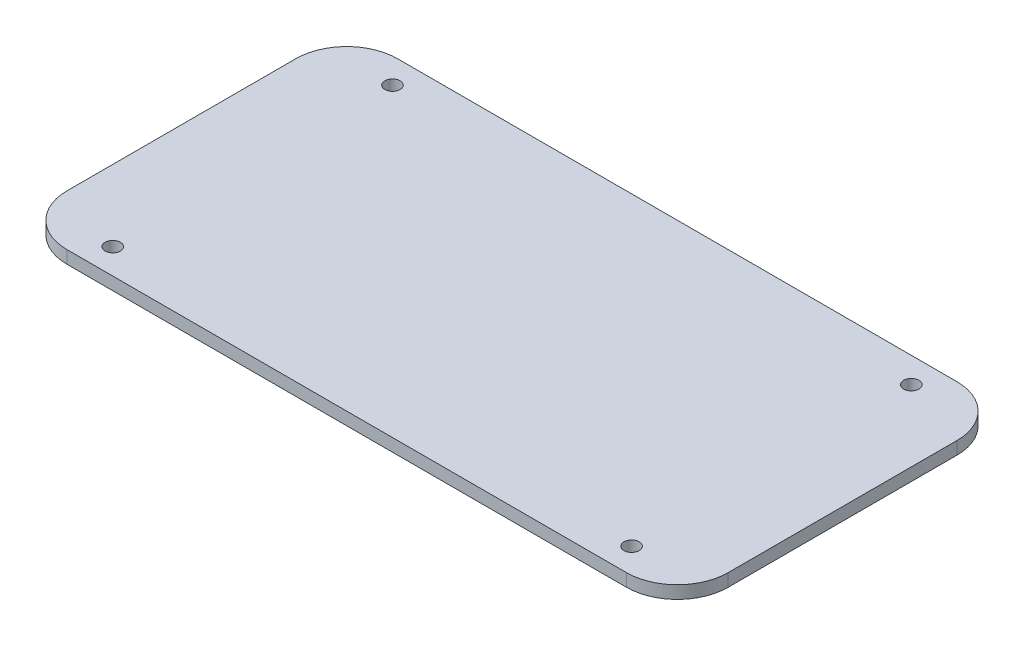
ISO-10303-21;
HEADER;
FILE_DESCRIPTION(('STEP AP214'),'2;1');
FILE_NAME('part.step','',(''),(''),'','','');
FILE_SCHEMA(('AUTOMOTIVE_DESIGN { 1 0 10303 214 1 1 1 1 }'));
ENDSEC;
DATA;
#1=APPLICATION_CONTEXT('core data for automotive mechanical design processes');
#2=APPLICATION_PROTOCOL_DEFINITION('international standard','automotive_design',2000,#1);
#3=PRODUCT_CONTEXT('',#1,'mechanical');
#4=PRODUCT('Part','Part','',(#3));
#5=PRODUCT_RELATED_PRODUCT_CATEGORY('part','',(#4));
#6=PRODUCT_DEFINITION_FORMATION('','',#4);
#7=PRODUCT_DEFINITION_CONTEXT('part definition',#1,'design');
#8=PRODUCT_DEFINITION('design','',#6,#7);
#9=PRODUCT_DEFINITION_SHAPE('','',#8);
#10=(LENGTH_UNIT() NAMED_UNIT(*) SI_UNIT(.MILLI.,.METRE.));
#11=(NAMED_UNIT(*) PLANE_ANGLE_UNIT() SI_UNIT($,.RADIAN.));
#12=(NAMED_UNIT(*) SI_UNIT($,.STERADIAN.) SOLID_ANGLE_UNIT());
#13=UNCERTAINTY_MEASURE_WITH_UNIT(LENGTH_MEASURE(1.E-05),#10,'distance_accuracy_value','');
#14=(GEOMETRIC_REPRESENTATION_CONTEXT(3) GLOBAL_UNCERTAINTY_ASSIGNED_CONTEXT((#13)) GLOBAL_UNIT_ASSIGNED_CONTEXT((#10,
#11,#12)) REPRESENTATION_CONTEXT('',''));
#15=CARTESIAN_POINT('',(0.,0.,0.));
#16=DIRECTION('',(0.,0.,1.));
#17=DIRECTION('',(1.,0.,0.));
#18=AXIS2_PLACEMENT_3D('',#15,#16,#17);
#19=CARTESIAN_POINT('',(10.,2.5,-55.));
#20=DIRECTION('',(0.,-1.,0.));
#21=DIRECTION('',(0.,0.,-1.));
#22=AXIS2_PLACEMENT_3D('',#19,#20,#21);
#23=CYLINDRICAL_SURFACE('',#22,10.);
#24=CARTESIAN_POINT('',(10.,0.,-55.));
#25=DIRECTION('',(0.,1.,0.));
#26=DIRECTION('',(0.,0.,1.));
#27=AXIS2_PLACEMENT_3D('',#24,#25,#26);
#28=CIRCLE('',#27,10.);
#29=CARTESIAN_POINT('',(10.,0.,-65.));
#30=VERTEX_POINT('',#29);
#31=CARTESIAN_POINT('',(0.,0.,-55.));
#32=VERTEX_POINT('',#31);
#33=EDGE_CURVE('E135',#30,#32,#28,.T.);
#34=ORIENTED_EDGE('',*,*,#33,.T.);
#35=DIRECTION('',(0.,-1.,0.));
#36=VECTOR('',#35,1.);
#37=CARTESIAN_POINT('',(0.,2.5,-55.));
#38=LINE('',#37,#36);
#39=CARTESIAN_POINT('',(0.,2.5,-55.));
#40=VERTEX_POINT('',#39);
#41=EDGE_CURVE('E11',#40,#32,#38,.T.);
#42=ORIENTED_EDGE('',*,*,#41,.F.);
#43=CARTESIAN_POINT('',(10.,2.5,-55.));
#44=DIRECTION('',(0.,1.,0.));
#45=DIRECTION('',(0.,0.,1.));
#46=AXIS2_PLACEMENT_3D('',#43,#44,#45);
#47=CIRCLE('',#46,10.);
#48=CARTESIAN_POINT('',(10.,2.5,-65.));
#49=VERTEX_POINT('',#48);
#50=EDGE_CURVE('E150',#49,#40,#47,.T.);
#51=ORIENTED_EDGE('',*,*,#50,.F.);
#52=DIRECTION('',(0.,-1.,0.));
#53=VECTOR('',#52,1.);
#54=CARTESIAN_POINT('',(10.,2.5,-65.));
#55=LINE('',#54,#53);
#56=EDGE_CURVE('E131',#49,#30,#55,.T.);
#57=ORIENTED_EDGE('',*,*,#56,.T.);
#58=EDGE_LOOP('',(#34,#42,#51,#57));
#59=FACE_BOUND('',#58,.T.);
#60=ADVANCED_FACE('F39',(#59),#23,.T.);
#61=CARTESIAN_POINT('',(0.,2.5,-10.0000000000001));
#62=DIRECTION('',(1.,0.,0.));
#63=DIRECTION('',(0.,0.,-1.));
#64=AXIS2_PLACEMENT_3D('',#61,#62,#63);
#65=PLANE('',#64);
#66=DIRECTION('',(0.,0.,1.));
#67=VECTOR('',#66,1.);
#68=CARTESIAN_POINT('',(0.,0.,-10.0000000000001));
#69=LINE('',#68,#67);
#70=CARTESIAN_POINT('',(0.,0.,-10.0000000000001));
#71=VERTEX_POINT('',#70);
#72=EDGE_CURVE('E138',#32,#71,#69,.T.);
#73=ORIENTED_EDGE('',*,*,#72,.T.);
#74=DIRECTION('',(0.,-1.,0.));
#75=VECTOR('',#74,1.);
#76=CARTESIAN_POINT('',(0.,2.5,-10.0000000000001));
#77=LINE('',#76,#75);
#78=CARTESIAN_POINT('',(0.,2.5,-10.0000000000001));
#79=VERTEX_POINT('',#78);
#80=EDGE_CURVE('E47',#79,#71,#77,.T.);
#81=ORIENTED_EDGE('',*,*,#80,.F.);
#82=DIRECTION('',(0.,0.,1.));
#83=VECTOR('',#82,1.);
#84=CARTESIAN_POINT('',(0.,2.5,-10.0000000000001));
#85=LINE('',#84,#83);
#86=EDGE_CURVE('E98',#40,#79,#85,.T.);
#87=ORIENTED_EDGE('',*,*,#86,.F.);
#88=ORIENTED_EDGE('',*,*,#41,.T.);
#89=EDGE_LOOP('',(#73,#81,#87,#88));
#90=FACE_BOUND('',#89,.T.);
#91=ADVANCED_FACE('F240',(#90),#65,.F.);
#92=CARTESIAN_POINT('',(10.,2.5,-10.));
#93=DIRECTION('',(0.,-1.,0.));
#94=DIRECTION('',(0.,0.,-1.));
#95=AXIS2_PLACEMENT_3D('',#92,#93,#94);
#96=CYLINDRICAL_SURFACE('',#95,10.);
#97=CARTESIAN_POINT('',(10.,0.,-10.));
#98=DIRECTION('',(0.,1.,0.));
#99=DIRECTION('',(0.,0.,1.));
#100=AXIS2_PLACEMENT_3D('',#97,#98,#99);
#101=CIRCLE('',#100,10.);
#102=CARTESIAN_POINT('',(10.0000000000001,0.,0.));
#103=VERTEX_POINT('',#102);
#104=EDGE_CURVE('E141',#71,#103,#101,.T.);
#105=ORIENTED_EDGE('',*,*,#104,.T.);
#106=DIRECTION('',(0.,-1.,0.));
#107=VECTOR('',#106,1.);
#108=CARTESIAN_POINT('',(10.0000000000001,2.5,0.));
#109=LINE('',#108,#107);
#110=CARTESIAN_POINT('',(10.0000000000001,2.5,0.));
#111=VERTEX_POINT('',#110);
#112=EDGE_CURVE('E157',#111,#103,#109,.T.);
#113=ORIENTED_EDGE('',*,*,#112,.F.);
#114=CARTESIAN_POINT('',(10.,2.5,-10.));
#115=DIRECTION('',(0.,1.,0.));
#116=DIRECTION('',(0.,0.,1.));
#117=AXIS2_PLACEMENT_3D('',#114,#115,#116);
#118=CIRCLE('',#117,10.);
#119=EDGE_CURVE('E165',#79,#111,#118,.T.);
#120=ORIENTED_EDGE('',*,*,#119,.F.);
#121=ORIENTED_EDGE('',*,*,#80,.T.);
#122=EDGE_LOOP('',(#105,#113,#120,#121));
#123=FACE_BOUND('',#122,.T.);
#124=ADVANCED_FACE('F163',(#123),#96,.T.);
#125=CARTESIAN_POINT('',(10.0000000000001,2.5,0.));
#126=DIRECTION('',(0.,0.,-1.));
#127=DIRECTION('',(-1.,0.,0.));
#128=AXIS2_PLACEMENT_3D('',#125,#126,#127);
#129=PLANE('',#128);
#130=DIRECTION('',(1.,0.,0.));
#131=VECTOR('',#130,1.);
#132=CARTESIAN_POINT('',(10.0000000000001,0.,0.));
#133=LINE('',#132,#131);
#134=CARTESIAN_POINT('',(120.,0.,0.));
#135=VERTEX_POINT('',#134);
#136=EDGE_CURVE('E143',#103,#135,#133,.T.);
#137=ORIENTED_EDGE('',*,*,#136,.T.);
#138=DIRECTION('',(0.,-1.,0.));
#139=VECTOR('',#138,1.);
#140=CARTESIAN_POINT('',(120.,2.5,0.));
#141=LINE('',#140,#139);
#142=CARTESIAN_POINT('',(120.,2.5,0.));
#143=VERTEX_POINT('',#142);
#144=EDGE_CURVE('E154',#143,#135,#141,.T.);
#145=ORIENTED_EDGE('',*,*,#144,.F.);
#146=DIRECTION('',(1.,0.,0.));
#147=VECTOR('',#146,1.);
#148=CARTESIAN_POINT('',(10.0000000000001,2.5,0.));
#149=LINE('',#148,#147);
#150=EDGE_CURVE('E177',#111,#143,#149,.T.);
#151=ORIENTED_EDGE('',*,*,#150,.F.);
#152=ORIENTED_EDGE('',*,*,#112,.T.);
#153=EDGE_LOOP('',(#137,#145,#151,#152));
#154=FACE_BOUND('',#153,.T.);
#155=ADVANCED_FACE('F173',(#154),#129,.F.);
#156=CARTESIAN_POINT('',(120.,2.5,-10.));
#157=DIRECTION('',(0.,-1.,0.));
#158=DIRECTION('',(0.,0.,-1.));
#159=AXIS2_PLACEMENT_3D('',#156,#157,#158);
#160=CYLINDRICAL_SURFACE('',#159,10.);
#161=CARTESIAN_POINT('',(120.,0.,-10.));
#162=DIRECTION('',(0.,1.,0.));
#163=DIRECTION('',(0.,0.,-1.));
#164=AXIS2_PLACEMENT_3D('',#161,#162,#163);
#165=CIRCLE('',#164,10.);
#166=CARTESIAN_POINT('',(130.,0.,-10.0000000000001));
#167=VERTEX_POINT('',#166);
#168=EDGE_CURVE('E145',#135,#167,#165,.T.);
#169=ORIENTED_EDGE('',*,*,#168,.T.);
#170=DIRECTION('',(0.,-1.,0.));
#171=VECTOR('',#170,1.);
#172=CARTESIAN_POINT('',(130.,2.5,-10.0000000000001));
#173=LINE('',#172,#171);
#174=CARTESIAN_POINT('',(130.,2.5,-10.0000000000001));
#175=VERTEX_POINT('',#174);
#176=EDGE_CURVE('E126',#175,#167,#173,.T.);
#177=ORIENTED_EDGE('',*,*,#176,.F.);
#178=CARTESIAN_POINT('',(120.,2.5,-10.));
#179=DIRECTION('',(0.,1.,0.));
#180=DIRECTION('',(0.,0.,-1.));
#181=AXIS2_PLACEMENT_3D('',#178,#179,#180);
#182=CIRCLE('',#181,10.);
#183=EDGE_CURVE('E117',#143,#175,#182,.T.);
#184=ORIENTED_EDGE('',*,*,#183,.F.);
#185=ORIENTED_EDGE('',*,*,#144,.T.);
#186=EDGE_LOOP('',(#169,#177,#184,#185));
#187=FACE_BOUND('',#186,.T.);
#188=ADVANCED_FACE('F176',(#187),#160,.T.);
#189=CARTESIAN_POINT('',(130.,2.5,-10.0000000000001));
#190=DIRECTION('',(-1.,0.,0.));
#191=DIRECTION('',(0.,0.,1.));
#192=AXIS2_PLACEMENT_3D('',#189,#190,#191);
#193=PLANE('',#192);
#194=DIRECTION('',(0.,0.,-1.));
#195=VECTOR('',#194,1.);
#196=CARTESIAN_POINT('',(130.,0.,-10.0000000000001));
#197=LINE('',#196,#195);
#198=CARTESIAN_POINT('',(130.,0.,-55.));
#199=VERTEX_POINT('',#198);
#200=EDGE_CURVE('E125',#167,#199,#197,.T.);
#201=ORIENTED_EDGE('',*,*,#200,.T.);
#202=DIRECTION('',(0.,-1.,0.));
#203=VECTOR('',#202,1.);
#204=CARTESIAN_POINT('',(130.,2.5,-55.));
#205=LINE('',#204,#203);
#206=CARTESIAN_POINT('',(130.,2.5,-55.));
#207=VERTEX_POINT('',#206);
#208=EDGE_CURVE('E122',#207,#199,#205,.T.);
#209=ORIENTED_EDGE('',*,*,#208,.F.);
#210=DIRECTION('',(0.,0.,-1.));
#211=VECTOR('',#210,1.);
#212=CARTESIAN_POINT('',(130.,2.5,-10.0000000000001));
#213=LINE('',#212,#211);
#214=EDGE_CURVE('E111',#175,#207,#213,.T.);
#215=ORIENTED_EDGE('',*,*,#214,.F.);
#216=ORIENTED_EDGE('',*,*,#176,.T.);
#217=EDGE_LOOP('',(#201,#209,#215,#216));
#218=FACE_BOUND('',#217,.T.);
#219=ADVANCED_FACE('F123',(#218),#193,.F.);
#220=CARTESIAN_POINT('',(120.,2.5,-55.));
#221=DIRECTION('',(0.,-1.,0.));
#222=DIRECTION('',(0.,0.,-1.));
#223=AXIS2_PLACEMENT_3D('',#220,#221,#222);
#224=CYLINDRICAL_SURFACE('',#223,10.);
#225=CARTESIAN_POINT('',(120.,0.,-55.));
#226=DIRECTION('',(0.,1.,0.));
#227=DIRECTION('',(0.,0.,-1.));
#228=AXIS2_PLACEMENT_3D('',#225,#226,#227);
#229=CIRCLE('',#228,10.);
#230=CARTESIAN_POINT('',(120.,0.,-65.));
#231=VERTEX_POINT('',#230);
#232=EDGE_CURVE('E84',#199,#231,#229,.T.);
#233=ORIENTED_EDGE('',*,*,#232,.T.);
#234=DIRECTION('',(0.,-1.,0.));
#235=VECTOR('',#234,1.);
#236=CARTESIAN_POINT('',(120.,2.5,-65.));
#237=LINE('',#236,#235);
#238=CARTESIAN_POINT('',(120.,2.5,-65.));
#239=VERTEX_POINT('',#238);
#240=EDGE_CURVE('E127',#239,#231,#237,.T.);
#241=ORIENTED_EDGE('',*,*,#240,.F.);
#242=CARTESIAN_POINT('',(120.,2.5,-55.));
#243=DIRECTION('',(0.,1.,0.));
#244=DIRECTION('',(0.,0.,-1.));
#245=AXIS2_PLACEMENT_3D('',#242,#243,#244);
#246=CIRCLE('',#245,10.);
#247=EDGE_CURVE('E115',#207,#239,#246,.T.);
#248=ORIENTED_EDGE('',*,*,#247,.F.);
#249=ORIENTED_EDGE('',*,*,#208,.T.);
#250=EDGE_LOOP('',(#233,#241,#248,#249));
#251=FACE_BOUND('',#250,.T.);
#252=ADVANCED_FACE('F129',(#251),#224,.T.);
#253=CARTESIAN_POINT('',(10.,2.5,-65.));
#254=DIRECTION('',(0.,0.,1.));
#255=DIRECTION('',(1.,0.,0.));
#256=AXIS2_PLACEMENT_3D('',#253,#254,#255);
#257=PLANE('',#256);
#258=DIRECTION('',(-1.,0.,0.));
#259=VECTOR('',#258,1.);
#260=CARTESIAN_POINT('',(10.,0.,-65.));
#261=LINE('',#260,#259);
#262=EDGE_CURVE('E90',#231,#30,#261,.T.);
#263=ORIENTED_EDGE('',*,*,#262,.T.);
#264=ORIENTED_EDGE('',*,*,#56,.F.);
#265=DIRECTION('',(-1.,0.,0.));
#266=VECTOR('',#265,1.);
#267=CARTESIAN_POINT('',(10.,2.5,-65.));
#268=LINE('',#267,#266);
#269=EDGE_CURVE('E55',#239,#49,#268,.T.);
#270=ORIENTED_EDGE('',*,*,#269,.F.);
#271=ORIENTED_EDGE('',*,*,#240,.T.);
#272=EDGE_LOOP('',(#263,#264,#270,#271));
#273=FACE_BOUND('',#272,.T.);
#274=ADVANCED_FACE('F218',(#273),#257,.F.);
#275=CARTESIAN_POINT('',(10.,2.5,-55.));
#276=DIRECTION('',(0.,1.,0.));
#277=DIRECTION('',(0.,0.,1.));
#278=AXIS2_PLACEMENT_3D('',#275,#276,#277);
#279=PLANE('',#278);
#280=CARTESIAN_POINT('',(116.,2.5,-60.));
#281=DIRECTION('',(0.,1.,0.));
#282=DIRECTION('',(0.,0.,-1.));
#283=AXIS2_PLACEMENT_3D('',#280,#281,#282);
#284=CIRCLE('',#283,1.5);
#285=CARTESIAN_POINT('',(116.,2.5,-61.5));
#286=VERTEX_POINT('',#285);
#287=EDGE_CURVE('E201',#286,#286,#284,.T.);
#288=ORIENTED_EDGE('',*,*,#287,.F.);
#289=EDGE_LOOP('',(#288));
#290=FACE_BOUND('',#289,.T.);
#291=CARTESIAN_POINT('',(116.,2.5,-4.99999999999997));
#292=DIRECTION('',(0.,1.,0.));
#293=DIRECTION('',(0.,0.,-1.));
#294=AXIS2_PLACEMENT_3D('',#291,#292,#293);
#295=CIRCLE('',#294,1.5);
#296=CARTESIAN_POINT('',(116.,2.5,-6.49999999999997));
#297=VERTEX_POINT('',#296);
#298=EDGE_CURVE('E195',#297,#297,#295,.T.);
#299=ORIENTED_EDGE('',*,*,#298,.F.);
#300=EDGE_LOOP('',(#299));
#301=FACE_BOUND('',#300,.T.);
#302=CARTESIAN_POINT('',(14.,2.5,-60.));
#303=DIRECTION('',(0.,1.,0.));
#304=DIRECTION('',(0.,0.,1.));
#305=AXIS2_PLACEMENT_3D('',#302,#303,#304);
#306=CIRCLE('',#305,1.5);
#307=CARTESIAN_POINT('',(14.,2.5,-58.5));
#308=VERTEX_POINT('',#307);
#309=EDGE_CURVE('E189',#308,#308,#306,.T.);
#310=ORIENTED_EDGE('',*,*,#309,.F.);
#311=EDGE_LOOP('',(#310));
#312=FACE_BOUND('',#311,.T.);
#313=CARTESIAN_POINT('',(14.,2.5,-5.));
#314=DIRECTION('',(0.,1.,0.));
#315=DIRECTION('',(0.,0.,1.));
#316=AXIS2_PLACEMENT_3D('',#313,#314,#315);
#317=CIRCLE('',#316,1.5);
#318=CARTESIAN_POINT('',(14.,2.5,-3.5));
#319=VERTEX_POINT('',#318);
#320=EDGE_CURVE('E183',#319,#319,#317,.T.);
#321=ORIENTED_EDGE('',*,*,#320,.F.);
#322=EDGE_LOOP('',(#321));
#323=FACE_BOUND('',#322,.T.);
#324=ORIENTED_EDGE('',*,*,#50,.T.);
#325=ORIENTED_EDGE('',*,*,#86,.T.);
#326=ORIENTED_EDGE('',*,*,#119,.T.);
#327=ORIENTED_EDGE('',*,*,#150,.T.);
#328=ORIENTED_EDGE('',*,*,#183,.T.);
#329=ORIENTED_EDGE('',*,*,#214,.T.);
#330=ORIENTED_EDGE('',*,*,#247,.T.);
#331=ORIENTED_EDGE('',*,*,#269,.T.);
#332=EDGE_LOOP('',(#324,#325,#326,#327,#328,#329,#330,#331));
#333=FACE_BOUND('',#332,.T.);
#334=ADVANCED_FACE('F113',(#290,#301,#312,#323,#333),#279,.T.);
#335=CARTESIAN_POINT('',(10.,0.,-55.));
#336=DIRECTION('',(0.,1.,0.));
#337=DIRECTION('',(0.,0.,1.));
#338=AXIS2_PLACEMENT_3D('',#335,#336,#337);
#339=PLANE('',#338);
#340=CARTESIAN_POINT('',(116.,0.,-60.));
#341=DIRECTION('',(0.,1.,0.));
#342=DIRECTION('',(0.,0.,-1.));
#343=AXIS2_PLACEMENT_3D('',#340,#341,#342);
#344=CIRCLE('',#343,1.5);
#345=CARTESIAN_POINT('',(116.,0.,-61.5));
#346=VERTEX_POINT('',#345);
#347=EDGE_CURVE('E198',#346,#346,#344,.T.);
#348=ORIENTED_EDGE('',*,*,#347,.T.);
#349=EDGE_LOOP('',(#348));
#350=FACE_BOUND('',#349,.T.);
#351=CARTESIAN_POINT('',(116.,0.,-4.99999999999997));
#352=DIRECTION('',(0.,1.,0.));
#353=DIRECTION('',(0.,0.,-1.));
#354=AXIS2_PLACEMENT_3D('',#351,#352,#353);
#355=CIRCLE('',#354,1.5);
#356=CARTESIAN_POINT('',(116.,0.,-6.49999999999997));
#357=VERTEX_POINT('',#356);
#358=EDGE_CURVE('E192',#357,#357,#355,.T.);
#359=ORIENTED_EDGE('',*,*,#358,.T.);
#360=EDGE_LOOP('',(#359));
#361=FACE_BOUND('',#360,.T.);
#362=CARTESIAN_POINT('',(14.,0.,-60.));
#363=DIRECTION('',(0.,1.,0.));
#364=DIRECTION('',(0.,0.,1.));
#365=AXIS2_PLACEMENT_3D('',#362,#363,#364);
#366=CIRCLE('',#365,1.5);
#367=CARTESIAN_POINT('',(14.,0.,-58.5));
#368=VERTEX_POINT('',#367);
#369=EDGE_CURVE('E186',#368,#368,#366,.T.);
#370=ORIENTED_EDGE('',*,*,#369,.T.);
#371=EDGE_LOOP('',(#370));
#372=FACE_BOUND('',#371,.T.);
#373=CARTESIAN_POINT('',(14.,0.,-5.));
#374=DIRECTION('',(0.,1.,0.));
#375=DIRECTION('',(0.,0.,1.));
#376=AXIS2_PLACEMENT_3D('',#373,#374,#375);
#377=CIRCLE('',#376,1.5);
#378=CARTESIAN_POINT('',(14.,0.,-3.5));
#379=VERTEX_POINT('',#378);
#380=EDGE_CURVE('E139',#379,#379,#377,.T.);
#381=ORIENTED_EDGE('',*,*,#380,.T.);
#382=EDGE_LOOP('',(#381));
#383=FACE_BOUND('',#382,.T.);
#384=ORIENTED_EDGE('',*,*,#33,.F.);
#385=ORIENTED_EDGE('',*,*,#262,.F.);
#386=ORIENTED_EDGE('',*,*,#232,.F.);
#387=ORIENTED_EDGE('',*,*,#200,.F.);
#388=ORIENTED_EDGE('',*,*,#168,.F.);
#389=ORIENTED_EDGE('',*,*,#136,.F.);
#390=ORIENTED_EDGE('',*,*,#104,.F.);
#391=ORIENTED_EDGE('',*,*,#72,.F.);
#392=EDGE_LOOP('',(#384,#385,#386,#387,#388,#389,#390,#391));
#393=FACE_BOUND('',#392,.T.);
#394=ADVANCED_FACE('F169',(#350,#361,#372,#383,#393),#339,.F.);
#395=CARTESIAN_POINT('',(14.,0.,-5.));
#396=DIRECTION('',(0.,1.,0.));
#397=DIRECTION('',(0.,0.,1.));
#398=AXIS2_PLACEMENT_3D('',#395,#396,#397);
#399=CYLINDRICAL_SURFACE('',#398,1.5);
#400=ORIENTED_EDGE('',*,*,#380,.F.);
#401=EDGE_LOOP('',(#400));
#402=FACE_BOUND('',#401,.T.);
#403=ORIENTED_EDGE('',*,*,#320,.T.);
#404=EDGE_LOOP('',(#403));
#405=FACE_BOUND('',#404,.T.);
#406=ADVANCED_FACE('F226',(#402,#405),#399,.F.);
#407=CARTESIAN_POINT('',(14.,0.,-60.));
#408=DIRECTION('',(0.,1.,0.));
#409=DIRECTION('',(0.,0.,1.));
#410=AXIS2_PLACEMENT_3D('',#407,#408,#409);
#411=CYLINDRICAL_SURFACE('',#410,1.5);
#412=ORIENTED_EDGE('',*,*,#369,.F.);
#413=EDGE_LOOP('',(#412));
#414=FACE_BOUND('',#413,.T.);
#415=ORIENTED_EDGE('',*,*,#309,.T.);
#416=EDGE_LOOP('',(#415));
#417=FACE_BOUND('',#416,.T.);
#418=ADVANCED_FACE('F228',(#414,#417),#411,.F.);
#419=CARTESIAN_POINT('',(116.,0.,-4.99999999999997));
#420=DIRECTION('',(0.,1.,0.));
#421=DIRECTION('',(0.,0.,1.));
#422=AXIS2_PLACEMENT_3D('',#419,#420,#421);
#423=CYLINDRICAL_SURFACE('',#422,1.5);
#424=ORIENTED_EDGE('',*,*,#358,.F.);
#425=EDGE_LOOP('',(#424));
#426=FACE_BOUND('',#425,.T.);
#427=ORIENTED_EDGE('',*,*,#298,.T.);
#428=EDGE_LOOP('',(#427));
#429=FACE_BOUND('',#428,.T.);
#430=ADVANCED_FACE('F212',(#426,#429),#423,.F.);
#431=CARTESIAN_POINT('',(116.,0.,-60.));
#432=DIRECTION('',(0.,1.,0.));
#433=DIRECTION('',(0.,0.,1.));
#434=AXIS2_PLACEMENT_3D('',#431,#432,#433);
#435=CYLINDRICAL_SURFACE('',#434,1.5);
#436=ORIENTED_EDGE('',*,*,#347,.F.);
#437=EDGE_LOOP('',(#436));
#438=FACE_BOUND('',#437,.T.);
#439=ORIENTED_EDGE('',*,*,#287,.T.);
#440=EDGE_LOOP('',(#439));
#441=FACE_BOUND('',#440,.T.);
#442=ADVANCED_FACE('F209',(#438,#441),#435,.F.);
#443=CLOSED_SHELL('',(#60,#91,#124,#155,#188,#219,#252,#274,#334,#394,#406,#418,#430,#442));
#444=MANIFOLD_SOLID_BREP('B2',#443);
#445=ADVANCED_BREP_SHAPE_REPRESENTATION('',(#18,#444),#14);
#446=SHAPE_DEFINITION_REPRESENTATION(#9,#445);
ENDSEC;
END-ISO-10303-21;
